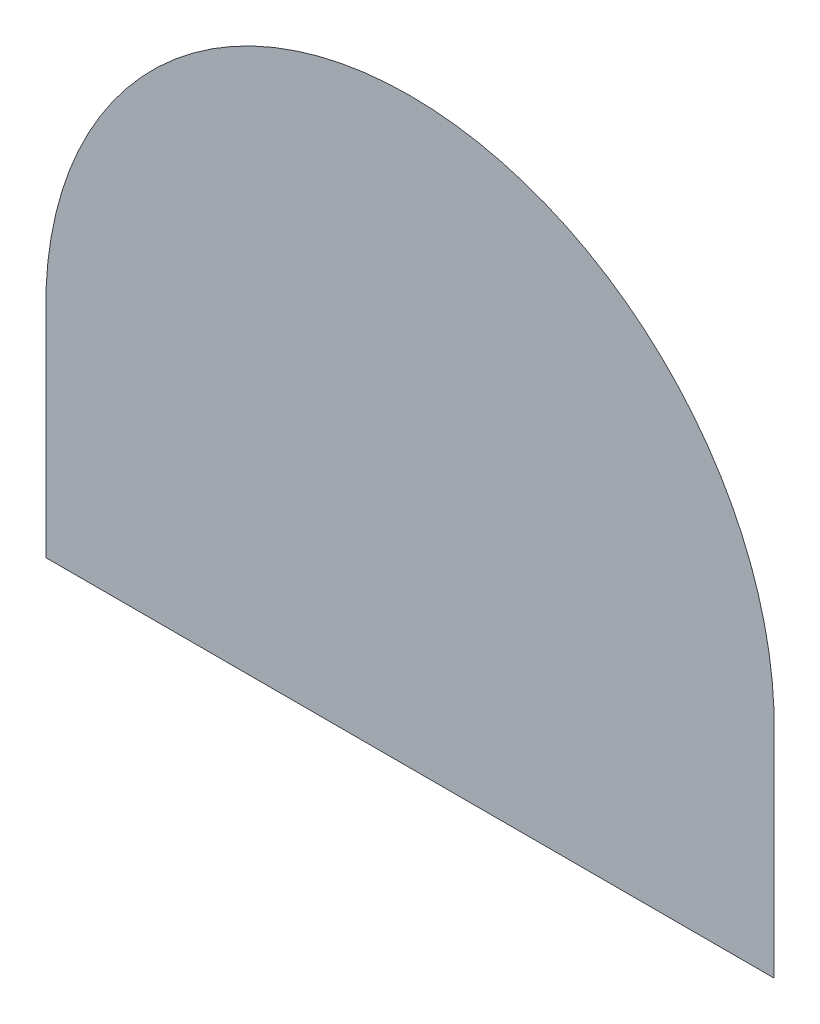
ISO-10303-21;
HEADER;
FILE_DESCRIPTION(('STEP AP214'),'2;1');
FILE_NAME('part.step','',(''),(''),'','','');
FILE_SCHEMA(('AUTOMOTIVE_DESIGN { 1 0 10303 214 1 1 1 1 }'));
ENDSEC;
DATA;
#1=APPLICATION_CONTEXT('core data for automotive mechanical design processes');
#2=APPLICATION_PROTOCOL_DEFINITION('international standard','automotive_design',2000,#1);
#3=PRODUCT_CONTEXT('',#1,'mechanical');
#4=PRODUCT('Part','Part','',(#3));
#5=PRODUCT_RELATED_PRODUCT_CATEGORY('part','',(#4));
#6=PRODUCT_DEFINITION_FORMATION('','',#4);
#7=PRODUCT_DEFINITION_CONTEXT('part definition',#1,'design');
#8=PRODUCT_DEFINITION('design','',#6,#7);
#9=PRODUCT_DEFINITION_SHAPE('','',#8);
#10=(LENGTH_UNIT() NAMED_UNIT(*) SI_UNIT(.MILLI.,.METRE.));
#11=(NAMED_UNIT(*) PLANE_ANGLE_UNIT() SI_UNIT($,.RADIAN.));
#12=(NAMED_UNIT(*) SI_UNIT($,.STERADIAN.) SOLID_ANGLE_UNIT());
#13=UNCERTAINTY_MEASURE_WITH_UNIT(LENGTH_MEASURE(1.E-05),#10,'distance_accuracy_value','');
#14=(GEOMETRIC_REPRESENTATION_CONTEXT(3) GLOBAL_UNCERTAINTY_ASSIGNED_CONTEXT((#13)) GLOBAL_UNIT_ASSIGNED_CONTEXT((#10,
#11,#12)) REPRESENTATION_CONTEXT('',''));
#15=CARTESIAN_POINT('',(0.,0.,0.));
#16=DIRECTION('',(0.,0.,1.));
#17=DIRECTION('',(1.,0.,0.));
#18=AXIS2_PLACEMENT_3D('',#15,#16,#17);
#19=CARTESIAN_POINT('',(245.,0.,0.0001));
#20=DIRECTION('',(-1.,0.,0.));
#21=DIRECTION('',(0.,0.,1.));
#22=AXIS2_PLACEMENT_3D('',#19,#20,#21);
#23=PLANE('',#22);
#24=DIRECTION('',(0.,1.,0.));
#25=VECTOR('',#24,1.);
#26=CARTESIAN_POINT('',(245.,0.,0.));
#27=LINE('',#26,#25);
#28=CARTESIAN_POINT('',(245.,0.,0.));
#29=VERTEX_POINT('',#28);
#30=CARTESIAN_POINT('',(245.,77.,0.));
#31=VERTEX_POINT('',#30);
#32=EDGE_CURVE('E95',#29,#31,#27,.T.);
#33=ORIENTED_EDGE('',*,*,#32,.T.);
#34=DIRECTION('',(0.,0.,-1.));
#35=VECTOR('',#34,1.);
#36=CARTESIAN_POINT('',(245.,77.,0.0001));
#37=LINE('',#36,#35);
#38=CARTESIAN_POINT('',(245.,77.,0.0001));
#39=VERTEX_POINT('',#38);
#40=EDGE_CURVE('E11',#39,#31,#37,.T.);
#41=ORIENTED_EDGE('',*,*,#40,.F.);
#42=DIRECTION('',(0.,1.,0.));
#43=VECTOR('',#42,1.);
#44=CARTESIAN_POINT('',(245.,0.,0.0001));
#45=LINE('',#44,#43);
#46=CARTESIAN_POINT('',(245.,0.,0.0001));
#47=VERTEX_POINT('',#46);
#48=EDGE_CURVE('E80',#47,#39,#45,.T.);
#49=ORIENTED_EDGE('',*,*,#48,.F.);
#50=DIRECTION('',(0.,0.,-1.));
#51=VECTOR('',#50,1.);
#52=CARTESIAN_POINT('',(245.,0.,0.0001));
#53=LINE('',#52,#51);
#54=EDGE_CURVE('E91',#47,#29,#53,.T.);
#55=ORIENTED_EDGE('',*,*,#54,.T.);
#56=EDGE_LOOP('',(#33,#41,#49,#55));
#57=FACE_BOUND('',#56,.T.);
#58=ADVANCED_FACE('F33',(#57),#23,.F.);
#59=CARTESIAN_POINT('',(125.,71.8913043478261,0.0001));
#60=DIRECTION('',(0.,0.,-1.));
#61=DIRECTION('',(-1.,0.,0.));
#62=AXIS2_PLACEMENT_3D('',#59,#60,#61);
#63=CYLINDRICAL_SURFACE('',#62,120.108695652174);
#64=CARTESIAN_POINT('',(125.,71.8913043478261,0.));
#65=DIRECTION('',(0.,0.,1.));
#66=DIRECTION('',(1.,0.,0.));
#67=AXIS2_PLACEMENT_3D('',#64,#65,#66);
#68=CIRCLE('',#67,120.108695652174);
#69=CARTESIAN_POINT('',(5.,77.,0.));
#70=VERTEX_POINT('',#69);
#71=EDGE_CURVE('E85',#31,#70,#68,.T.);
#72=ORIENTED_EDGE('',*,*,#71,.T.);
#73=DIRECTION('',(0.,0.,-1.));
#74=VECTOR('',#73,1.);
#75=CARTESIAN_POINT('',(5.,77.,0.0001));
#76=LINE('',#75,#74);
#77=CARTESIAN_POINT('',(5.,77.,0.0001));
#78=VERTEX_POINT('',#77);
#79=EDGE_CURVE('E41',#78,#70,#76,.T.);
#80=ORIENTED_EDGE('',*,*,#79,.F.);
#81=CARTESIAN_POINT('',(125.,71.8913043478261,0.0001));
#82=DIRECTION('',(0.,0.,1.));
#83=DIRECTION('',(1.,0.,0.));
#84=AXIS2_PLACEMENT_3D('',#81,#82,#83);
#85=CIRCLE('',#84,120.108695652174);
#86=EDGE_CURVE('E75',#39,#78,#85,.T.);
#87=ORIENTED_EDGE('',*,*,#86,.F.);
#88=ORIENTED_EDGE('',*,*,#40,.T.);
#89=EDGE_LOOP('',(#72,#80,#87,#88));
#90=FACE_BOUND('',#89,.T.);
#91=ADVANCED_FACE('F84',(#90),#63,.T.);
#92=CARTESIAN_POINT('',(5.,0.,0.0001));
#93=DIRECTION('',(-1.,0.,0.));
#94=DIRECTION('',(0.,-1.,0.));
#95=AXIS2_PLACEMENT_3D('',#92,#93,#94);
#96=PLANE('',#95);
#97=DIRECTION('',(0.,1.,0.));
#98=VECTOR('',#97,1.);
#99=CARTESIAN_POINT('',(5.,0.,0.));
#100=LINE('',#99,#98);
#101=CARTESIAN_POINT('',(5.,0.,0.));
#102=VERTEX_POINT('',#101);
#103=EDGE_CURVE('E99',#102,#70,#100,.T.);
#104=ORIENTED_EDGE('',*,*,#103,.F.);
#105=DIRECTION('',(0.,0.,-1.));
#106=VECTOR('',#105,1.);
#107=CARTESIAN_POINT('',(5.,0.,0.0001));
#108=LINE('',#107,#106);
#109=CARTESIAN_POINT('',(5.,0.,0.0001));
#110=VERTEX_POINT('',#109);
#111=EDGE_CURVE('E65',#110,#102,#108,.T.);
#112=ORIENTED_EDGE('',*,*,#111,.F.);
#113=DIRECTION('',(0.,1.,0.));
#114=VECTOR('',#113,1.);
#115=CARTESIAN_POINT('',(5.,0.,0.0001));
#116=LINE('',#115,#114);
#117=EDGE_CURVE('E78',#110,#78,#116,.T.);
#118=ORIENTED_EDGE('',*,*,#117,.T.);
#119=ORIENTED_EDGE('',*,*,#79,.T.);
#120=EDGE_LOOP('',(#104,#112,#118,#119));
#121=FACE_BOUND('',#120,.T.);
#122=ADVANCED_FACE('F89',(#121),#96,.T.);
#123=CARTESIAN_POINT('',(5.,0.,0.0001));
#124=DIRECTION('',(0.,1.,0.));
#125=DIRECTION('',(0.,0.,1.));
#126=AXIS2_PLACEMENT_3D('',#123,#124,#125);
#127=PLANE('',#126);
#128=DIRECTION('',(1.,0.,0.));
#129=VECTOR('',#128,1.);
#130=CARTESIAN_POINT('',(5.,0.,0.));
#131=LINE('',#130,#129);
#132=EDGE_CURVE('E68',#102,#29,#131,.T.);
#133=ORIENTED_EDGE('',*,*,#132,.T.);
#134=ORIENTED_EDGE('',*,*,#54,.F.);
#135=DIRECTION('',(1.,0.,0.));
#136=VECTOR('',#135,1.);
#137=CARTESIAN_POINT('',(5.,0.,0.0001));
#138=LINE('',#137,#136);
#139=EDGE_CURVE('E49',#110,#47,#138,.T.);
#140=ORIENTED_EDGE('',*,*,#139,.F.);
#141=ORIENTED_EDGE('',*,*,#111,.T.);
#142=EDGE_LOOP('',(#133,#134,#140,#141));
#143=FACE_BOUND('',#142,.T.);
#144=ADVANCED_FACE('F112',(#143),#127,.F.);
#145=CARTESIAN_POINT('',(125.,71.8913043478261,0.0001));
#146=DIRECTION('',(0.,0.,1.));
#147=DIRECTION('',(1.,0.,0.));
#148=AXIS2_PLACEMENT_3D('',#145,#146,#147);
#149=PLANE('',#148);
#150=ORIENTED_EDGE('',*,*,#48,.T.);
#151=ORIENTED_EDGE('',*,*,#86,.T.);
#152=ORIENTED_EDGE('',*,*,#117,.F.);
#153=ORIENTED_EDGE('',*,*,#139,.T.);
#154=EDGE_LOOP('',(#150,#151,#152,#153));
#155=FACE_BOUND('',#154,.T.);
#156=ADVANCED_FACE('F76',(#155),#149,.T.);
#157=CARTESIAN_POINT('',(125.,71.8913043478261,0.));
#158=DIRECTION('',(0.,0.,1.));
#159=DIRECTION('',(1.,0.,0.));
#160=AXIS2_PLACEMENT_3D('',#157,#158,#159);
#161=PLANE('',#160);
#162=ORIENTED_EDGE('',*,*,#32,.F.);
#163=ORIENTED_EDGE('',*,*,#132,.F.);
#164=ORIENTED_EDGE('',*,*,#103,.T.);
#165=ORIENTED_EDGE('',*,*,#71,.F.);
#166=EDGE_LOOP('',(#162,#163,#164,#165));
#167=FACE_BOUND('',#166,.T.);
#168=ADVANCED_FACE('F106',(#167),#161,.F.);
#169=CLOSED_SHELL('',(#58,#91,#122,#144,#156,#168));
#170=MANIFOLD_SOLID_BREP('B2',#169);
#171=ADVANCED_BREP_SHAPE_REPRESENTATION('',(#18,#170),#14);
#172=SHAPE_DEFINITION_REPRESENTATION(#9,#171);
ENDSEC;
END-ISO-10303-21;
